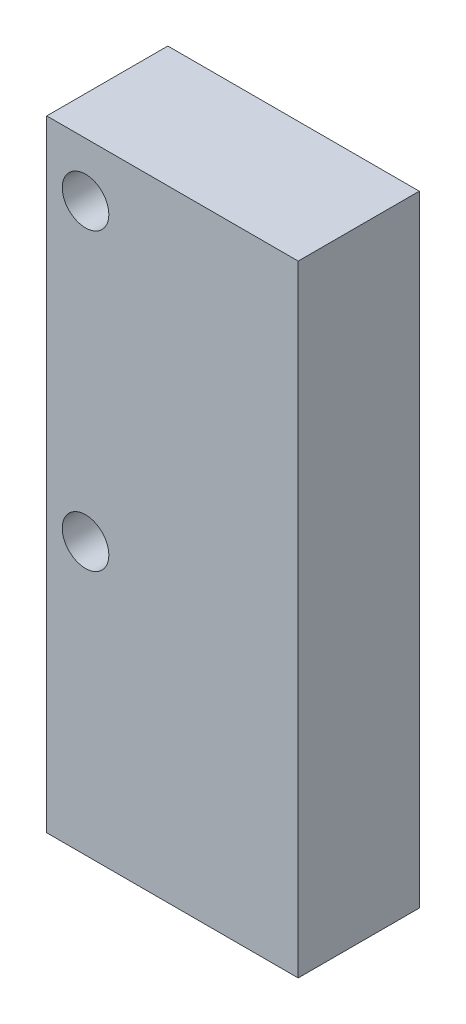
ISO-10303-21;
HEADER;
FILE_DESCRIPTION(('STEP AP214'),'2;1');
FILE_NAME('part.step','',(''),(''),'','','');
FILE_SCHEMA(('AUTOMOTIVE_DESIGN { 1 0 10303 214 1 1 1 1 }'));
ENDSEC;
DATA;
#1=APPLICATION_CONTEXT('core data for automotive mechanical design processes');
#2=APPLICATION_PROTOCOL_DEFINITION('international standard','automotive_design',2000,#1);
#3=PRODUCT_CONTEXT('',#1,'mechanical');
#4=PRODUCT('Part','Part','',(#3));
#5=PRODUCT_RELATED_PRODUCT_CATEGORY('part','',(#4));
#6=PRODUCT_DEFINITION_FORMATION('','',#4);
#7=PRODUCT_DEFINITION_CONTEXT('part definition',#1,'design');
#8=PRODUCT_DEFINITION('design','',#6,#7);
#9=PRODUCT_DEFINITION_SHAPE('','',#8);
#10=(LENGTH_UNIT() NAMED_UNIT(*) SI_UNIT(.MILLI.,.METRE.));
#11=(NAMED_UNIT(*) PLANE_ANGLE_UNIT() SI_UNIT($,.RADIAN.));
#12=(NAMED_UNIT(*) SI_UNIT($,.STERADIAN.) SOLID_ANGLE_UNIT());
#13=UNCERTAINTY_MEASURE_WITH_UNIT(LENGTH_MEASURE(1.E-05),#10,'distance_accuracy_value','');
#14=(GEOMETRIC_REPRESENTATION_CONTEXT(3) GLOBAL_UNCERTAINTY_ASSIGNED_CONTEXT((#13)) GLOBAL_UNIT_ASSIGNED_CONTEXT((#10,
#11,#12)) REPRESENTATION_CONTEXT('',''));
#15=CARTESIAN_POINT('',(0.,0.,0.));
#16=DIRECTION('',(0.,0.,1.));
#17=DIRECTION('',(1.,0.,0.));
#18=AXIS2_PLACEMENT_3D('',#15,#16,#17);
#19=CARTESIAN_POINT('',(8.1,20.,7.8));
#20=DIRECTION('',(-1.,0.,0.));
#21=DIRECTION('',(0.,-1.,0.));
#22=AXIS2_PLACEMENT_3D('',#19,#20,#21);
#23=PLANE('',#22);
#24=DIRECTION('',(0.,1.,0.));
#25=VECTOR('',#24,1.);
#26=CARTESIAN_POINT('',(8.1,20.,0.));
#27=LINE('',#26,#25);
#28=CARTESIAN_POINT('',(8.1,-20.,0.));
#29=VERTEX_POINT('',#28);
#30=CARTESIAN_POINT('',(8.1,20.,0.));
#31=VERTEX_POINT('',#30);
#32=EDGE_CURVE('E96',#29,#31,#27,.T.);
#33=ORIENTED_EDGE('',*,*,#32,.T.);
#34=DIRECTION('',(0.,0.,-1.));
#35=VECTOR('',#34,1.);
#36=CARTESIAN_POINT('',(8.1,20.,7.8));
#37=LINE('',#36,#35);
#38=CARTESIAN_POINT('',(8.1,20.,7.8));
#39=VERTEX_POINT('',#38);
#40=EDGE_CURVE('E11',#39,#31,#37,.T.);
#41=ORIENTED_EDGE('',*,*,#40,.F.);
#42=DIRECTION('',(0.,1.,0.));
#43=VECTOR('',#42,1.);
#44=CARTESIAN_POINT('',(8.1,20.,7.8));
#45=LINE('',#44,#43);
#46=CARTESIAN_POINT('',(8.1,-20.,7.8));
#47=VERTEX_POINT('',#46);
#48=EDGE_CURVE('E84',#47,#39,#45,.T.);
#49=ORIENTED_EDGE('',*,*,#48,.F.);
#50=DIRECTION('',(0.,0.,-1.));
#51=VECTOR('',#50,1.);
#52=CARTESIAN_POINT('',(8.1,-20.,7.8));
#53=LINE('',#52,#51);
#54=EDGE_CURVE('E92',#47,#29,#53,.T.);
#55=ORIENTED_EDGE('',*,*,#54,.T.);
#56=EDGE_LOOP('',(#33,#41,#49,#55));
#57=FACE_BOUND('',#56,.T.);
#58=ADVANCED_FACE('F33',(#57),#23,.F.);
#59=CARTESIAN_POINT('',(-8.1,20.,7.8));
#60=DIRECTION('',(0.,-1.,0.));
#61=DIRECTION('',(0.,0.,-1.));
#62=AXIS2_PLACEMENT_3D('',#59,#60,#61);
#63=PLANE('',#62);
#64=DIRECTION('',(-1.,0.,0.));
#65=VECTOR('',#64,1.);
#66=CARTESIAN_POINT('',(-8.1,20.,0.));
#67=LINE('',#66,#65);
#68=CARTESIAN_POINT('',(-8.1,20.,0.));
#69=VERTEX_POINT('',#68);
#70=EDGE_CURVE('E88',#31,#69,#67,.T.);
#71=ORIENTED_EDGE('',*,*,#70,.T.);
#72=DIRECTION('',(0.,0.,-1.));
#73=VECTOR('',#72,1.);
#74=CARTESIAN_POINT('',(-8.1,20.,7.8));
#75=LINE('',#74,#73);
#76=CARTESIAN_POINT('',(-8.1,20.,7.8));
#77=VERTEX_POINT('',#76);
#78=EDGE_CURVE('E41',#77,#69,#75,.T.);
#79=ORIENTED_EDGE('',*,*,#78,.F.);
#80=DIRECTION('',(-1.,0.,0.));
#81=VECTOR('',#80,1.);
#82=CARTESIAN_POINT('',(-8.1,20.,7.8));
#83=LINE('',#82,#81);
#84=EDGE_CURVE('E79',#39,#77,#83,.T.);
#85=ORIENTED_EDGE('',*,*,#84,.F.);
#86=ORIENTED_EDGE('',*,*,#40,.T.);
#87=EDGE_LOOP('',(#71,#79,#85,#86));
#88=FACE_BOUND('',#87,.T.);
#89=ADVANCED_FACE('F87',(#88),#63,.F.);
#90=CARTESIAN_POINT('',(-8.1,20.,7.8));
#91=DIRECTION('',(1.,0.,0.));
#92=DIRECTION('',(0.,1.,0.));
#93=AXIS2_PLACEMENT_3D('',#90,#91,#92);
#94=PLANE('',#93);
#95=DIRECTION('',(0.,-1.,0.));
#96=VECTOR('',#95,1.);
#97=CARTESIAN_POINT('',(-8.1,20.,0.));
#98=LINE('',#97,#96);
#99=CARTESIAN_POINT('',(-8.1,-20.,0.));
#100=VERTEX_POINT('',#99);
#101=EDGE_CURVE('E66',#69,#100,#98,.T.);
#102=ORIENTED_EDGE('',*,*,#101,.T.);
#103=DIRECTION('',(0.,0.,-1.));
#104=VECTOR('',#103,1.);
#105=CARTESIAN_POINT('',(-8.1,-20.,7.8));
#106=LINE('',#105,#104);
#107=CARTESIAN_POINT('',(-8.1,-20.,7.8));
#108=VERTEX_POINT('',#107);
#109=EDGE_CURVE('E89',#108,#100,#106,.T.);
#110=ORIENTED_EDGE('',*,*,#109,.F.);
#111=DIRECTION('',(0.,-1.,0.));
#112=VECTOR('',#111,1.);
#113=CARTESIAN_POINT('',(-8.1,20.,7.8));
#114=LINE('',#113,#112);
#115=EDGE_CURVE('E82',#77,#108,#114,.T.);
#116=ORIENTED_EDGE('',*,*,#115,.F.);
#117=ORIENTED_EDGE('',*,*,#78,.T.);
#118=EDGE_LOOP('',(#102,#110,#116,#117));
#119=FACE_BOUND('',#118,.T.);
#120=ADVANCED_FACE('F90',(#119),#94,.F.);
#121=CARTESIAN_POINT('',(-8.1,-20.,7.8));
#122=DIRECTION('',(0.,1.,0.));
#123=DIRECTION('',(0.,0.,1.));
#124=AXIS2_PLACEMENT_3D('',#121,#122,#123);
#125=PLANE('',#124);
#126=DIRECTION('',(1.,0.,0.));
#127=VECTOR('',#126,1.);
#128=CARTESIAN_POINT('',(-8.1,-20.,0.));
#129=LINE('',#128,#127);
#130=EDGE_CURVE('E72',#100,#29,#129,.T.);
#131=ORIENTED_EDGE('',*,*,#130,.T.);
#132=ORIENTED_EDGE('',*,*,#54,.F.);
#133=DIRECTION('',(1.,0.,0.));
#134=VECTOR('',#133,1.);
#135=CARTESIAN_POINT('',(-8.1,-20.,7.8));
#136=LINE('',#135,#134);
#137=EDGE_CURVE('E49',#108,#47,#136,.T.);
#138=ORIENTED_EDGE('',*,*,#137,.F.);
#139=ORIENTED_EDGE('',*,*,#109,.T.);
#140=EDGE_LOOP('',(#131,#132,#138,#139));
#141=FACE_BOUND('',#140,.T.);
#142=ADVANCED_FACE('F104',(#141),#125,.F.);
#143=CARTESIAN_POINT('',(0.,0.,7.8));
#144=DIRECTION('',(0.,0.,1.));
#145=DIRECTION('',(1.,0.,0.));
#146=AXIS2_PLACEMENT_3D('',#143,#144,#145);
#147=PLANE('',#146);
#148=CARTESIAN_POINT('',(-5.6,-2.5,7.8));
#149=DIRECTION('',(0.,0.,1.));
#150=DIRECTION('',(1.,0.,0.));
#151=AXIS2_PLACEMENT_3D('',#148,#149,#150);
#152=CIRCLE('',#151,1.5);
#153=CARTESIAN_POINT('',(-4.1,-2.5,7.8));
#154=VERTEX_POINT('',#153);
#155=EDGE_CURVE('E116',#154,#154,#152,.T.);
#156=ORIENTED_EDGE('',*,*,#155,.F.);
#157=EDGE_LOOP('',(#156));
#158=FACE_BOUND('',#157,.T.);
#159=CARTESIAN_POINT('',(-5.6,16.5,7.8));
#160=DIRECTION('',(0.,0.,1.));
#161=DIRECTION('',(1.,0.,0.));
#162=AXIS2_PLACEMENT_3D('',#159,#160,#161);
#163=CIRCLE('',#162,1.5);
#164=CARTESIAN_POINT('',(-4.1,16.5,7.8));
#165=VERTEX_POINT('',#164);
#166=EDGE_CURVE('E110',#165,#165,#163,.T.);
#167=ORIENTED_EDGE('',*,*,#166,.F.);
#168=EDGE_LOOP('',(#167));
#169=FACE_BOUND('',#168,.T.);
#170=ORIENTED_EDGE('',*,*,#48,.T.);
#171=ORIENTED_EDGE('',*,*,#84,.T.);
#172=ORIENTED_EDGE('',*,*,#115,.T.);
#173=ORIENTED_EDGE('',*,*,#137,.T.);
#174=EDGE_LOOP('',(#170,#171,#172,#173));
#175=FACE_BOUND('',#174,.T.);
#176=ADVANCED_FACE('F80',(#158,#169,#175),#147,.T.);
#177=CARTESIAN_POINT('',(0.,0.,0.));
#178=DIRECTION('',(0.,0.,1.));
#179=DIRECTION('',(1.,0.,0.));
#180=AXIS2_PLACEMENT_3D('',#177,#178,#179);
#181=PLANE('',#180);
#182=CARTESIAN_POINT('',(-5.6,-2.5,0.));
#183=DIRECTION('',(0.,0.,1.));
#184=DIRECTION('',(1.,0.,0.));
#185=AXIS2_PLACEMENT_3D('',#182,#183,#184);
#186=CIRCLE('',#185,1.5);
#187=CARTESIAN_POINT('',(-4.1,-2.5,0.));
#188=VERTEX_POINT('',#187);
#189=EDGE_CURVE('E113',#188,#188,#186,.T.);
#190=ORIENTED_EDGE('',*,*,#189,.T.);
#191=EDGE_LOOP('',(#190));
#192=FACE_BOUND('',#191,.T.);
#193=CARTESIAN_POINT('',(-5.6,16.5,0.));
#194=DIRECTION('',(0.,0.,1.));
#195=DIRECTION('',(1.,0.,0.));
#196=AXIS2_PLACEMENT_3D('',#193,#194,#195);
#197=CIRCLE('',#196,1.5);
#198=CARTESIAN_POINT('',(-4.1,16.5,0.));
#199=VERTEX_POINT('',#198);
#200=EDGE_CURVE('E99',#199,#199,#197,.T.);
#201=ORIENTED_EDGE('',*,*,#200,.T.);
#202=EDGE_LOOP('',(#201));
#203=FACE_BOUND('',#202,.T.);
#204=ORIENTED_EDGE('',*,*,#32,.F.);
#205=ORIENTED_EDGE('',*,*,#130,.F.);
#206=ORIENTED_EDGE('',*,*,#101,.F.);
#207=ORIENTED_EDGE('',*,*,#70,.F.);
#208=EDGE_LOOP('',(#204,#205,#206,#207));
#209=FACE_BOUND('',#208,.T.);
#210=ADVANCED_FACE('F107',(#192,#203,#209),#181,.F.);
#211=CARTESIAN_POINT('',(-5.6,16.5,0.));
#212=DIRECTION('',(0.,0.,1.));
#213=DIRECTION('',(1.,0.,0.));
#214=AXIS2_PLACEMENT_3D('',#211,#212,#213);
#215=CYLINDRICAL_SURFACE('',#214,1.5);
#216=ORIENTED_EDGE('',*,*,#200,.F.);
#217=EDGE_LOOP('',(#216));
#218=FACE_BOUND('',#217,.T.);
#219=ORIENTED_EDGE('',*,*,#166,.T.);
#220=EDGE_LOOP('',(#219));
#221=FACE_BOUND('',#220,.T.);
#222=ADVANCED_FACE('F127',(#218,#221),#215,.F.);
#223=CARTESIAN_POINT('',(-5.6,-2.5,0.));
#224=DIRECTION('',(0.,0.,1.));
#225=DIRECTION('',(1.,0.,0.));
#226=AXIS2_PLACEMENT_3D('',#223,#224,#225);
#227=CYLINDRICAL_SURFACE('',#226,1.5);
#228=ORIENTED_EDGE('',*,*,#189,.F.);
#229=EDGE_LOOP('',(#228));
#230=FACE_BOUND('',#229,.T.);
#231=ORIENTED_EDGE('',*,*,#155,.T.);
#232=EDGE_LOOP('',(#231));
#233=FACE_BOUND('',#232,.T.);
#234=ADVANCED_FACE('F124',(#230,#233),#227,.F.);
#235=CLOSED_SHELL('',(#58,#89,#120,#142,#176,#210,#222,#234));
#236=MANIFOLD_SOLID_BREP('B2',#235);
#237=ADVANCED_BREP_SHAPE_REPRESENTATION('',(#18,#236),#14);
#238=SHAPE_DEFINITION_REPRESENTATION(#9,#237);
ENDSEC;
END-ISO-10303-21;
